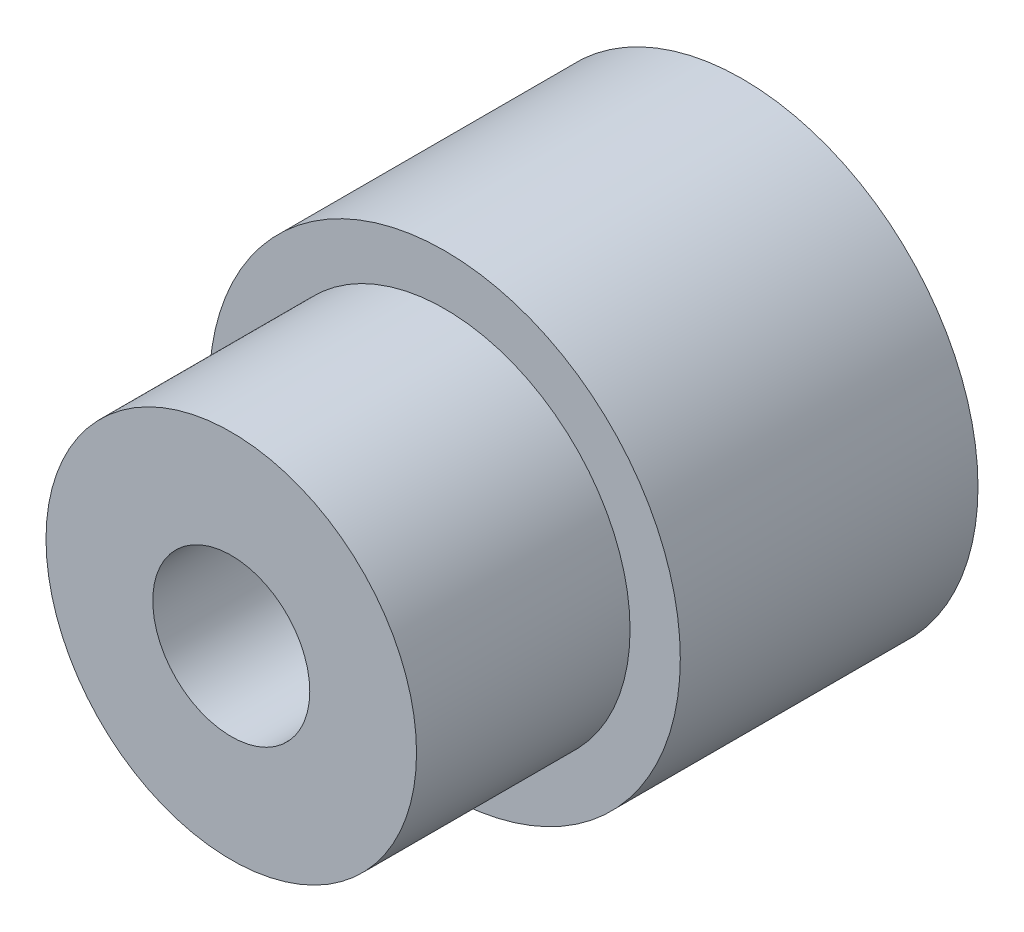
ISO-10303-21;
HEADER;
FILE_DESCRIPTION(('STEP AP214'),'2;1');
FILE_NAME('part.step','',(''),(''),'','','');
FILE_SCHEMA(('AUTOMOTIVE_DESIGN { 1 0 10303 214 1 1 1 1 }'));
ENDSEC;
DATA;
#1=APPLICATION_CONTEXT('core data for automotive mechanical design processes');
#2=APPLICATION_PROTOCOL_DEFINITION('international standard','automotive_design',2000,#1);
#3=PRODUCT_CONTEXT('',#1,'mechanical');
#4=PRODUCT('Part','Part','',(#3));
#5=PRODUCT_RELATED_PRODUCT_CATEGORY('part','',(#4));
#6=PRODUCT_DEFINITION_FORMATION('','',#4);
#7=PRODUCT_DEFINITION_CONTEXT('part definition',#1,'design');
#8=PRODUCT_DEFINITION('design','',#6,#7);
#9=PRODUCT_DEFINITION_SHAPE('','',#8);
#10=(LENGTH_UNIT() NAMED_UNIT(*) SI_UNIT(.MILLI.,.METRE.));
#11=(NAMED_UNIT(*) PLANE_ANGLE_UNIT() SI_UNIT($,.RADIAN.));
#12=(NAMED_UNIT(*) SI_UNIT($,.STERADIAN.) SOLID_ANGLE_UNIT());
#13=UNCERTAINTY_MEASURE_WITH_UNIT(LENGTH_MEASURE(1.E-05),#10,'distance_accuracy_value','');
#14=(GEOMETRIC_REPRESENTATION_CONTEXT(3) GLOBAL_UNCERTAINTY_ASSIGNED_CONTEXT((#13)) GLOBAL_UNIT_ASSIGNED_CONTEXT((#10,
#11,#12)) REPRESENTATION_CONTEXT('',''));
#15=CARTESIAN_POINT('',(0.,0.,0.));
#16=DIRECTION('',(0.,0.,1.));
#17=DIRECTION('',(1.,0.,0.));
#18=AXIS2_PLACEMENT_3D('',#15,#16,#17);
#19=CARTESIAN_POINT('',(0.,0.,6.0198));
#20=DIRECTION('',(0.,0.,1.));
#21=DIRECTION('',(1.,0.,0.));
#22=AXIS2_PLACEMENT_3D('',#19,#20,#21);
#23=PLANE('',#22);
#24=CARTESIAN_POINT('',(0.,0.,6.0198));
#25=DIRECTION('',(0.,0.,1.));
#26=DIRECTION('',(1.,0.,0.));
#27=AXIS2_PLACEMENT_3D('',#24,#25,#26);
#28=CIRCLE('',#27,4.7625);
#29=CARTESIAN_POINT('',(4.7625,0.,6.0198));
#30=VERTEX_POINT('',#29);
#31=EDGE_CURVE('E10',#30,#30,#28,.T.);
#32=ORIENTED_EDGE('',*,*,#31,.T.);
#33=EDGE_LOOP('',(#32));
#34=FACE_BOUND('',#33,.T.);
#35=CARTESIAN_POINT('',(0.,0.,6.0198));
#36=DIRECTION('',(0.,0.,1.));
#37=DIRECTION('',(1.,0.,0.));
#38=AXIS2_PLACEMENT_3D('',#35,#36,#37);
#39=CIRCLE('',#38,3.7465);
#40=CARTESIAN_POINT('',(3.7465,0.,6.0198));
#41=VERTEX_POINT('',#40);
#42=EDGE_CURVE('E42',#41,#41,#39,.T.);
#43=ORIENTED_EDGE('',*,*,#42,.F.);
#44=EDGE_LOOP('',(#43));
#45=FACE_BOUND('',#44,.T.);
#46=ADVANCED_FACE('F29',(#34,#45),#23,.T.);
#47=CARTESIAN_POINT('',(0.,0.,6.0198));
#48=DIRECTION('',(0.,0.,-1.));
#49=DIRECTION('',(-1.,0.,0.));
#50=AXIS2_PLACEMENT_3D('',#47,#48,#49);
#51=CYLINDRICAL_SURFACE('',#50,4.7625);
#52=ORIENTED_EDGE('',*,*,#31,.F.);
#53=EDGE_LOOP('',(#52));
#54=FACE_BOUND('',#53,.T.);
#55=CARTESIAN_POINT('',(0.,0.,0.));
#56=DIRECTION('',(0.,0.,1.));
#57=DIRECTION('',(1.,0.,0.));
#58=AXIS2_PLACEMENT_3D('',#55,#56,#57);
#59=CIRCLE('',#58,4.7625);
#60=CARTESIAN_POINT('',(4.7625,0.,0.));
#61=VERTEX_POINT('',#60);
#62=EDGE_CURVE('E33',#61,#61,#59,.T.);
#63=ORIENTED_EDGE('',*,*,#62,.T.);
#64=EDGE_LOOP('',(#63));
#65=FACE_BOUND('',#64,.T.);
#66=ADVANCED_FACE('F31',(#54,#65),#51,.T.);
#67=CARTESIAN_POINT('',(0.,0.,0.));
#68=DIRECTION('',(0.,0.,1.));
#69=DIRECTION('',(1.,0.,0.));
#70=AXIS2_PLACEMENT_3D('',#67,#68,#69);
#71=PLANE('',#70);
#72=CARTESIAN_POINT('',(0.,0.,0.));
#73=DIRECTION('',(0.,0.,1.));
#74=DIRECTION('',(1.,0.,0.));
#75=AXIS2_PLACEMENT_3D('',#72,#73,#74);
#76=CIRCLE('',#75,1.5875);
#77=CARTESIAN_POINT('',(1.5875,0.,0.));
#78=VERTEX_POINT('',#77);
#79=EDGE_CURVE('E45',#78,#78,#76,.T.);
#80=ORIENTED_EDGE('',*,*,#79,.T.);
#81=EDGE_LOOP('',(#80));
#82=FACE_BOUND('',#81,.T.);
#83=ORIENTED_EDGE('',*,*,#62,.F.);
#84=EDGE_LOOP('',(#83));
#85=FACE_BOUND('',#84,.T.);
#86=ADVANCED_FACE('F54',(#82,#85),#71,.F.);
#87=CARTESIAN_POINT('',(0.,0.,10.3378));
#88=DIRECTION('',(0.,0.,-1.));
#89=DIRECTION('',(-1.,0.,0.));
#90=AXIS2_PLACEMENT_3D('',#87,#88,#89);
#91=CYLINDRICAL_SURFACE('',#90,3.7465);
#92=CARTESIAN_POINT('',(0.,0.,10.3378));
#93=DIRECTION('',(0.,0.,1.));
#94=DIRECTION('',(1.,0.,0.));
#95=AXIS2_PLACEMENT_3D('',#92,#93,#94);
#96=CIRCLE('',#95,3.7465);
#97=CARTESIAN_POINT('',(3.7465,0.,10.3378));
#98=VERTEX_POINT('',#97);
#99=EDGE_CURVE('E40',#98,#98,#96,.T.);
#100=ORIENTED_EDGE('',*,*,#99,.F.);
#101=EDGE_LOOP('',(#100));
#102=FACE_BOUND('',#101,.T.);
#103=ORIENTED_EDGE('',*,*,#42,.T.);
#104=EDGE_LOOP('',(#103));
#105=FACE_BOUND('',#104,.T.);
#106=ADVANCED_FACE('F66',(#102,#105),#91,.T.);
#107=CARTESIAN_POINT('',(0.,0.,10.3378));
#108=DIRECTION('',(0.,0.,1.));
#109=DIRECTION('',(1.,0.,0.));
#110=AXIS2_PLACEMENT_3D('',#107,#108,#109);
#111=PLANE('',#110);
#112=CARTESIAN_POINT('',(0.,0.,10.3378));
#113=DIRECTION('',(0.,0.,1.));
#114=DIRECTION('',(1.,0.,0.));
#115=AXIS2_PLACEMENT_3D('',#112,#113,#114);
#116=CIRCLE('',#115,1.5875);
#117=CARTESIAN_POINT('',(1.5875,0.,10.3378));
#118=VERTEX_POINT('',#117);
#119=EDGE_CURVE('E48',#118,#118,#116,.T.);
#120=ORIENTED_EDGE('',*,*,#119,.F.);
#121=EDGE_LOOP('',(#120));
#122=FACE_BOUND('',#121,.T.);
#123=ORIENTED_EDGE('',*,*,#99,.T.);
#124=EDGE_LOOP('',(#123));
#125=FACE_BOUND('',#124,.T.);
#126=ADVANCED_FACE('F60',(#122,#125),#111,.T.);
#127=CARTESIAN_POINT('',(0.,0.,0.));
#128=DIRECTION('',(0.,0.,1.));
#129=DIRECTION('',(1.,0.,0.));
#130=AXIS2_PLACEMENT_3D('',#127,#128,#129);
#131=CYLINDRICAL_SURFACE('',#130,1.5875);
#132=ORIENTED_EDGE('',*,*,#79,.F.);
#133=EDGE_LOOP('',(#132));
#134=FACE_BOUND('',#133,.T.);
#135=ORIENTED_EDGE('',*,*,#119,.T.);
#136=EDGE_LOOP('',(#135));
#137=FACE_BOUND('',#136,.T.);
#138=ADVANCED_FACE('F57',(#134,#137),#131,.F.);
#139=CLOSED_SHELL('',(#46,#66,#86,#106,#126,#138));
#140=MANIFOLD_SOLID_BREP('B2',#139);
#141=ADVANCED_BREP_SHAPE_REPRESENTATION('',(#18,#140),#14);
#142=SHAPE_DEFINITION_REPRESENTATION(#9,#141);
ENDSEC;
END-ISO-10303-21;
